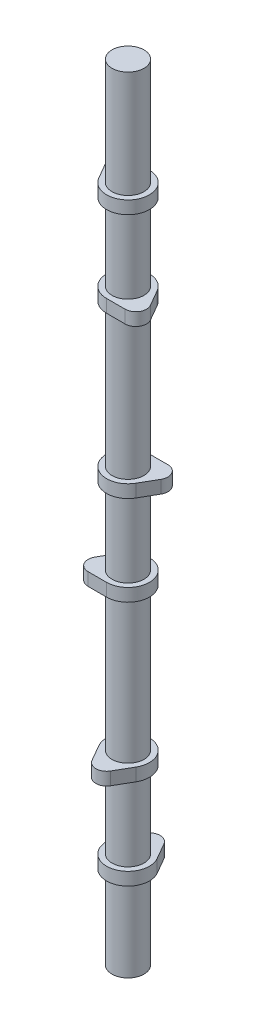
ISO-10303-21;
HEADER;
FILE_DESCRIPTION(('STEP AP214'),'2;1');
FILE_NAME('part.step','',(''),(''),'','','');
FILE_SCHEMA(('AUTOMOTIVE_DESIGN { 1 0 10303 214 1 1 1 1 }'));
ENDSEC;
DATA;
#1=APPLICATION_CONTEXT('core data for automotive mechanical design processes');
#2=APPLICATION_PROTOCOL_DEFINITION('international standard','automotive_design',2000,#1);
#3=PRODUCT_CONTEXT('',#1,'mechanical');
#4=PRODUCT('Part','Part','',(#3));
#5=PRODUCT_RELATED_PRODUCT_CATEGORY('part','',(#4));
#6=PRODUCT_DEFINITION_FORMATION('','',#4);
#7=PRODUCT_DEFINITION_CONTEXT('part definition',#1,'design');
#8=PRODUCT_DEFINITION('design','',#6,#7);
#9=PRODUCT_DEFINITION_SHAPE('','',#8);
#10=(LENGTH_UNIT() NAMED_UNIT(*) SI_UNIT(.MILLI.,.METRE.));
#11=(NAMED_UNIT(*) PLANE_ANGLE_UNIT() SI_UNIT($,.RADIAN.));
#12=(NAMED_UNIT(*) SI_UNIT($,.STERADIAN.) SOLID_ANGLE_UNIT());
#13=UNCERTAINTY_MEASURE_WITH_UNIT(LENGTH_MEASURE(1.E-05),#10,'distance_accuracy_value','');
#14=(GEOMETRIC_REPRESENTATION_CONTEXT(3) GLOBAL_UNCERTAINTY_ASSIGNED_CONTEXT((#13)) GLOBAL_UNIT_ASSIGNED_CONTEXT((#10,
#11,#12)) REPRESENTATION_CONTEXT('',''));
#15=CARTESIAN_POINT('',(0.,0.,0.));
#16=DIRECTION('',(0.,0.,1.));
#17=DIRECTION('',(1.,0.,0.));
#18=AXIS2_PLACEMENT_3D('',#15,#16,#17);
#19=CARTESIAN_POINT('',(0.,416.56,0.));
#20=DIRECTION('',(0.,-1.,0.));
#21=DIRECTION('',(0.,0.,-1.));
#22=AXIS2_PLACEMENT_3D('',#19,#20,#21);
#23=CYLINDRICAL_SURFACE('',#22,9.5);
#24=CARTESIAN_POINT('',(0.,299.72,0.));
#25=DIRECTION('',(0.,1.,0.));
#26=DIRECTION('',(0.,0.,1.));
#27=AXIS2_PLACEMENT_3D('',#24,#25,#26);
#28=CIRCLE('',#27,9.5);
#29=CARTESIAN_POINT('',(0.,299.72,9.5));
#30=VERTEX_POINT('',#29);
#31=EDGE_CURVE('E277',#30,#30,#28,.T.);
#32=ORIENTED_EDGE('',*,*,#31,.T.);
#33=EDGE_LOOP('',(#32));
#34=FACE_BOUND('',#33,.T.);
#35=CARTESIAN_POINT('',(0.,345.44,0.));
#36=DIRECTION('',(0.,1.,0.));
#37=DIRECTION('',(0.,0.,1.));
#38=AXIS2_PLACEMENT_3D('',#35,#36,#37);
#39=CIRCLE('',#38,9.5);
#40=CARTESIAN_POINT('',(0.,345.44,9.5));
#41=VERTEX_POINT('',#40);
#42=EDGE_CURVE('E11',#41,#41,#39,.T.);
#43=ORIENTED_EDGE('',*,*,#42,.F.);
#44=EDGE_LOOP('',(#43));
#45=FACE_BOUND('',#44,.T.);
#46=ADVANCED_FACE('F43',(#34,#45),#23,.T.);
#47=CARTESIAN_POINT('',(0.,207.01,0.));
#48=DIRECTION('',(0.,1.,0.));
#49=DIRECTION('',(0.,0.,1.));
#50=AXIS2_PLACEMENT_3D('',#47,#48,#49);
#51=CIRCLE('',#50,9.5);
#52=CARTESIAN_POINT('',(0.,207.01,9.5));
#53=VERTEX_POINT('',#52);
#54=EDGE_CURVE('E308',#53,#53,#51,.T.);
#55=ORIENTED_EDGE('',*,*,#54,.T.);
#56=EDGE_LOOP('',(#55));
#57=FACE_BOUND('',#56,.T.);
#58=CARTESIAN_POINT('',(0.,292.1,0.));
#59=DIRECTION('',(0.,1.,0.));
#60=DIRECTION('',(0.,0.,1.));
#61=AXIS2_PLACEMENT_3D('',#58,#59,#60);
#62=CIRCLE('',#61,9.5);
#63=CARTESIAN_POINT('',(0.,292.1,9.5));
#64=VERTEX_POINT('',#63);
#65=EDGE_CURVE('E53',#64,#64,#62,.T.);
#66=ORIENTED_EDGE('',*,*,#65,.F.);
#67=EDGE_LOOP('',(#66));
#68=FACE_BOUND('',#67,.T.);
#69=ADVANCED_FACE('F459',(#57,#68),#23,.T.);
#70=CARTESIAN_POINT('',(0.,153.67,0.));
#71=DIRECTION('',(0.,1.,0.));
#72=DIRECTION('',(0.,0.,1.));
#73=AXIS2_PLACEMENT_3D('',#70,#71,#72);
#74=CIRCLE('',#73,9.5);
#75=CARTESIAN_POINT('',(0.,153.67,9.5));
#76=VERTEX_POINT('',#75);
#77=EDGE_CURVE('E339',#76,#76,#74,.T.);
#78=ORIENTED_EDGE('',*,*,#77,.T.);
#79=EDGE_LOOP('',(#78));
#80=FACE_BOUND('',#79,.T.);
#81=CARTESIAN_POINT('',(0.,199.39,0.));
#82=DIRECTION('',(0.,1.,0.));
#83=DIRECTION('',(0.,0.,1.));
#84=AXIS2_PLACEMENT_3D('',#81,#82,#83);
#85=CIRCLE('',#84,9.5);
#86=CARTESIAN_POINT('',(0.,199.39,9.5));
#87=VERTEX_POINT('',#86);
#88=EDGE_CURVE('E412',#87,#87,#85,.T.);
#89=ORIENTED_EDGE('',*,*,#88,.F.);
#90=EDGE_LOOP('',(#89));
#91=FACE_BOUND('',#90,.T.);
#92=ADVANCED_FACE('F466',(#80,#91),#23,.T.);
#93=CARTESIAN_POINT('',(0.,60.96,0.));
#94=DIRECTION('',(0.,1.,0.));
#95=DIRECTION('',(0.,0.,1.));
#96=AXIS2_PLACEMENT_3D('',#93,#94,#95);
#97=CIRCLE('',#96,9.5);
#98=CARTESIAN_POINT('',(0.,60.96,9.5));
#99=VERTEX_POINT('',#98);
#100=EDGE_CURVE('E370',#99,#99,#97,.T.);
#101=ORIENTED_EDGE('',*,*,#100,.T.);
#102=EDGE_LOOP('',(#101));
#103=FACE_BOUND('',#102,.T.);
#104=CARTESIAN_POINT('',(0.,146.05,0.));
#105=DIRECTION('',(0.,1.,0.));
#106=DIRECTION('',(0.,0.,1.));
#107=AXIS2_PLACEMENT_3D('',#104,#105,#106);
#108=CIRCLE('',#107,9.5);
#109=CARTESIAN_POINT('',(0.,146.05,9.5));
#110=VERTEX_POINT('',#109);
#111=EDGE_CURVE('E407',#110,#110,#108,.T.);
#112=ORIENTED_EDGE('',*,*,#111,.F.);
#113=EDGE_LOOP('',(#112));
#114=FACE_BOUND('',#113,.T.);
#115=ADVANCED_FACE('F497',(#103,#114),#23,.T.);
#116=CARTESIAN_POINT('',(0.,7.62000000000002,0.));
#117=DIRECTION('',(0.,1.,0.));
#118=DIRECTION('',(0.,0.,1.));
#119=AXIS2_PLACEMENT_3D('',#116,#117,#118);
#120=CIRCLE('',#119,9.5);
#121=CARTESIAN_POINT('',(0.,7.62000000000002,9.5));
#122=VERTEX_POINT('',#121);
#123=EDGE_CURVE('E374',#122,#122,#120,.F.);
#124=ORIENTED_EDGE('',*,*,#123,.F.);
#125=EDGE_LOOP('',(#124));
#126=FACE_BOUND('',#125,.T.);
#127=CARTESIAN_POINT('',(0.,53.34,0.));
#128=DIRECTION('',(0.,1.,0.));
#129=DIRECTION('',(0.,0.,1.));
#130=AXIS2_PLACEMENT_3D('',#127,#128,#129);
#131=CIRCLE('',#130,9.5);
#132=CARTESIAN_POINT('',(0.,53.34,9.5));
#133=VERTEX_POINT('',#132);
#134=EDGE_CURVE('E404',#133,#133,#131,.T.);
#135=ORIENTED_EDGE('',*,*,#134,.F.);
#136=EDGE_LOOP('',(#135));
#137=FACE_BOUND('',#136,.T.);
#138=ADVANCED_FACE('F485',(#126,#137),#23,.T.);
#139=CARTESIAN_POINT('',(0.,7.62,-12.7));
#140=DIRECTION('',(0.,-1.,0.));
#141=DIRECTION('',(0.,0.,-1.));
#142=AXIS2_PLACEMENT_3D('',#139,#140,#141);
#143=CYLINDRICAL_SURFACE('',#142,6.35);
#144=CARTESIAN_POINT('',(0.,0.,-12.7));
#145=DIRECTION('',(0.,1.,0.));
#146=DIRECTION('',(0.,0.,1.));
#147=AXIS2_PLACEMENT_3D('',#144,#145,#146);
#148=CIRCLE('',#147,6.35);
#149=CARTESIAN_POINT('',(5.49926131403118,0.,-15.875));
#150=VERTEX_POINT('',#149);
#151=CARTESIAN_POINT('',(-5.49926131403118,0.,-15.875));
#152=VERTEX_POINT('',#151);
#153=EDGE_CURVE('E380',#150,#152,#148,.T.);
#154=ORIENTED_EDGE('',*,*,#153,.T.);
#155=DIRECTION('',(0.,-1.,0.));
#156=VECTOR('',#155,1.);
#157=CARTESIAN_POINT('',(-5.49926131403118,7.62,-15.875));
#158=LINE('',#157,#156);
#159=CARTESIAN_POINT('',(-5.49926131403118,7.62,-15.875));
#160=VERTEX_POINT('',#159);
#161=EDGE_CURVE('E399',#160,#152,#158,.T.);
#162=ORIENTED_EDGE('',*,*,#161,.F.);
#163=CARTESIAN_POINT('',(0.,7.62,-12.7));
#164=DIRECTION('',(0.,1.,0.));
#165=DIRECTION('',(0.,0.,1.));
#166=AXIS2_PLACEMENT_3D('',#163,#164,#165);
#167=CIRCLE('',#166,6.35);
#168=CARTESIAN_POINT('',(5.49926131403118,7.62,-15.875));
#169=VERTEX_POINT('',#168);
#170=EDGE_CURVE('E381',#169,#160,#167,.T.);
#171=ORIENTED_EDGE('',*,*,#170,.F.);
#172=DIRECTION('',(0.,-1.,0.));
#173=VECTOR('',#172,1.);
#174=CARTESIAN_POINT('',(5.49926131403118,7.62,-15.875));
#175=LINE('',#174,#173);
#176=EDGE_CURVE('E387',#169,#150,#175,.T.);
#177=ORIENTED_EDGE('',*,*,#176,.T.);
#178=EDGE_LOOP('',(#154,#162,#171,#177));
#179=FACE_BOUND('',#178,.T.);
#180=ADVANCED_FACE('F45',(#179),#143,.T.);
#181=CARTESIAN_POINT('',(-5.49926131403118,7.62,-15.875));
#182=DIRECTION('',(0.866025403784439,0.,0.5));
#183=DIRECTION('',(0.5,0.,-0.866025403784439));
#184=AXIS2_PLACEMENT_3D('',#181,#182,#183);
#185=PLANE('',#184);
#186=DIRECTION('',(-0.5,0.,0.866025403784439));
#187=VECTOR('',#186,1.);
#188=CARTESIAN_POINT('',(-5.49926131403118,0.,-15.875));
#189=LINE('',#188,#187);
#190=CARTESIAN_POINT('',(-10.9985226280624,0.,-6.35000000000001));
#191=VERTEX_POINT('',#190);
#192=EDGE_CURVE('E390',#152,#191,#189,.T.);
#193=ORIENTED_EDGE('',*,*,#192,.T.);
#194=DIRECTION('',(0.,-1.,0.));
#195=VECTOR('',#194,1.);
#196=CARTESIAN_POINT('',(-10.9985226280624,7.62,-6.35000000000001));
#197=LINE('',#196,#195);
#198=CARTESIAN_POINT('',(-10.9985226280624,7.62,-6.35000000000001));
#199=VERTEX_POINT('',#198);
#200=EDGE_CURVE('E397',#199,#191,#197,.T.);
#201=ORIENTED_EDGE('',*,*,#200,.F.);
#202=DIRECTION('',(-0.5,0.,0.866025403784439));
#203=VECTOR('',#202,1.);
#204=CARTESIAN_POINT('',(-5.49926131403118,7.62,-15.875));
#205=LINE('',#204,#203);
#206=EDGE_CURVE('E93',#160,#199,#205,.T.);
#207=ORIENTED_EDGE('',*,*,#206,.F.);
#208=ORIENTED_EDGE('',*,*,#161,.T.);
#209=EDGE_LOOP('',(#193,#201,#207,#208));
#210=FACE_BOUND('',#209,.T.);
#211=ADVANCED_FACE('F504',(#210),#185,.F.);
#212=CARTESIAN_POINT('',(0.,7.62,0.));
#213=DIRECTION('',(0.,-1.,0.));
#214=DIRECTION('',(0.,0.,-1.));
#215=AXIS2_PLACEMENT_3D('',#212,#213,#214);
#216=CYLINDRICAL_SURFACE('',#215,12.7);
#217=CARTESIAN_POINT('',(0.,0.,0.));
#218=DIRECTION('',(0.,1.,0.));
#219=DIRECTION('',(0.,0.,1.));
#220=AXIS2_PLACEMENT_3D('',#217,#218,#219);
#221=CIRCLE('',#220,12.7);
#222=CARTESIAN_POINT('',(10.9985226280624,0.,-6.35));
#223=VERTEX_POINT('',#222);
#224=EDGE_CURVE('E79',#191,#223,#221,.T.);
#225=ORIENTED_EDGE('',*,*,#224,.T.);
#226=DIRECTION('',(0.,-1.,0.));
#227=VECTOR('',#226,1.);
#228=CARTESIAN_POINT('',(10.9985226280624,7.62,-6.35));
#229=LINE('',#228,#227);
#230=CARTESIAN_POINT('',(10.9985226280624,7.62,-6.35));
#231=VERTEX_POINT('',#230);
#232=EDGE_CURVE('E395',#231,#223,#229,.T.);
#233=ORIENTED_EDGE('',*,*,#232,.F.);
#234=CARTESIAN_POINT('',(0.,7.62,0.));
#235=DIRECTION('',(0.,1.,0.));
#236=DIRECTION('',(0.,0.,1.));
#237=AXIS2_PLACEMENT_3D('',#234,#235,#236);
#238=CIRCLE('',#237,12.7);
#239=EDGE_CURVE('E384',#199,#231,#238,.T.);
#240=ORIENTED_EDGE('',*,*,#239,.F.);
#241=ORIENTED_EDGE('',*,*,#200,.T.);
#242=EDGE_LOOP('',(#225,#233,#240,#241));
#243=FACE_BOUND('',#242,.T.);
#244=ADVANCED_FACE('F855',(#243),#216,.T.);
#245=CARTESIAN_POINT('',(5.49926131403118,7.62,-15.875));
#246=DIRECTION('',(-0.866025403784438,0.,0.5));
#247=DIRECTION('',(0.5,0.,0.866025403784439));
#248=AXIS2_PLACEMENT_3D('',#245,#246,#247);
#249=PLANE('',#248);
#250=DIRECTION('',(-0.5,0.,-0.866025403784439));
#251=VECTOR('',#250,1.);
#252=CARTESIAN_POINT('',(5.49926131403118,0.,-15.875));
#253=LINE('',#252,#251);
#254=EDGE_CURVE('E85',#223,#150,#253,.T.);
#255=ORIENTED_EDGE('',*,*,#254,.T.);
#256=ORIENTED_EDGE('',*,*,#176,.F.);
#257=DIRECTION('',(-0.5,0.,-0.866025403784439));
#258=VECTOR('',#257,1.);
#259=CARTESIAN_POINT('',(5.49926131403118,7.62,-15.875));
#260=LINE('',#259,#258);
#261=EDGE_CURVE('E61',#231,#169,#260,.T.);
#262=ORIENTED_EDGE('',*,*,#261,.F.);
#263=ORIENTED_EDGE('',*,*,#232,.T.);
#264=EDGE_LOOP('',(#255,#256,#262,#263));
#265=FACE_BOUND('',#264,.T.);
#266=ADVANCED_FACE('F844',(#265),#249,.F.);
#267=CARTESIAN_POINT('',(0.,7.62,-12.7));
#268=DIRECTION('',(0.,1.,0.));
#269=DIRECTION('',(0.,0.,1.));
#270=AXIS2_PLACEMENT_3D('',#267,#268,#269);
#271=PLANE('',#270);
#272=ORIENTED_EDGE('',*,*,#123,.T.);
#273=EDGE_LOOP('',(#272));
#274=FACE_BOUND('',#273,.T.);
#275=ORIENTED_EDGE('',*,*,#170,.T.);
#276=ORIENTED_EDGE('',*,*,#206,.T.);
#277=ORIENTED_EDGE('',*,*,#239,.T.);
#278=ORIENTED_EDGE('',*,*,#261,.T.);
#279=EDGE_LOOP('',(#275,#276,#277,#278));
#280=FACE_BOUND('',#279,.T.);
#281=ADVANCED_FACE('F836',(#274,#280),#271,.T.);
#282=CARTESIAN_POINT('',(0.,0.,-12.7));
#283=DIRECTION('',(0.,1.,0.));
#284=DIRECTION('',(0.,0.,1.));
#285=AXIS2_PLACEMENT_3D('',#282,#283,#284);
#286=PLANE('',#285);
#287=CARTESIAN_POINT('',(0.,0.,0.));
#288=DIRECTION('',(0.,1.,0.));
#289=DIRECTION('',(0.,0.,1.));
#290=AXIS2_PLACEMENT_3D('',#287,#288,#289);
#291=CIRCLE('',#290,9.5);
#292=CARTESIAN_POINT('',(0.,0.,9.5));
#293=VERTEX_POINT('',#292);
#294=EDGE_CURVE('E401',#293,#293,#291,.F.);
#295=ORIENTED_EDGE('',*,*,#294,.F.);
#296=EDGE_LOOP('',(#295));
#297=FACE_BOUND('',#296,.T.);
#298=ORIENTED_EDGE('',*,*,#153,.F.);
#299=ORIENTED_EDGE('',*,*,#254,.F.);
#300=ORIENTED_EDGE('',*,*,#224,.F.);
#301=ORIENTED_EDGE('',*,*,#192,.F.);
#302=EDGE_LOOP('',(#298,#299,#300,#301));
#303=FACE_BOUND('',#302,.T.);
#304=ADVANCED_FACE('F493',(#297,#303),#286,.F.);
#305=CARTESIAN_POINT('',(0.,-49.53,0.));
#306=DIRECTION('',(0.,1.,0.));
#307=DIRECTION('',(0.,0.,1.));
#308=AXIS2_PLACEMENT_3D('',#305,#306,#307);
#309=PLANE('',#308);
#310=CARTESIAN_POINT('',(0.,-49.53,0.));
#311=DIRECTION('',(0.,1.,0.));
#312=DIRECTION('',(0.,0.,1.));
#313=AXIS2_PLACEMENT_3D('',#310,#311,#312);
#314=CIRCLE('',#313,9.5);
#315=CARTESIAN_POINT('',(0.,-49.53,9.5));
#316=VERTEX_POINT('',#315);
#317=EDGE_CURVE('E375',#316,#316,#314,.T.);
#318=ORIENTED_EDGE('',*,*,#317,.F.);
#319=EDGE_LOOP('',(#318));
#320=FACE_BOUND('',#319,.T.);
#321=ADVANCED_FACE('F483',(#320),#309,.F.);
#322=ORIENTED_EDGE('',*,*,#317,.T.);
#323=EDGE_LOOP('',(#322));
#324=FACE_BOUND('',#323,.T.);
#325=ORIENTED_EDGE('',*,*,#294,.T.);
#326=EDGE_LOOP('',(#325));
#327=FACE_BOUND('',#326,.T.);
#328=ADVANCED_FACE('F473',(#324,#327),#23,.T.);
#329=CARTESIAN_POINT('',(0.,60.96,12.7));
#330=DIRECTION('',(0.,-1.,0.));
#331=DIRECTION('',(0.,0.,1.));
#332=AXIS2_PLACEMENT_3D('',#329,#330,#331);
#333=CYLINDRICAL_SURFACE('',#332,6.35);
#334=CARTESIAN_POINT('',(0.,53.34,12.7));
#335=DIRECTION('',(0.,1.,0.));
#336=DIRECTION('',(0.,0.,-1.));
#337=AXIS2_PLACEMENT_3D('',#334,#335,#336);
#338=CIRCLE('',#337,6.35);
#339=CARTESIAN_POINT('',(-5.4992613140313,53.34,15.875));
#340=VERTEX_POINT('',#339);
#341=CARTESIAN_POINT('',(5.49926131403107,53.34,15.875));
#342=VERTEX_POINT('',#341);
#343=EDGE_CURVE('E351',#340,#342,#338,.T.);
#344=ORIENTED_EDGE('',*,*,#343,.T.);
#345=DIRECTION('',(0.,-1.,0.));
#346=VECTOR('',#345,1.);
#347=CARTESIAN_POINT('',(5.49926131403107,60.96,15.875));
#348=LINE('',#347,#346);
#349=CARTESIAN_POINT('',(5.49926131403107,60.96,15.875));
#350=VERTEX_POINT('',#349);
#351=EDGE_CURVE('E367',#350,#342,#348,.T.);
#352=ORIENTED_EDGE('',*,*,#351,.F.);
#353=CARTESIAN_POINT('',(0.,60.96,12.7));
#354=DIRECTION('',(0.,1.,0.));
#355=DIRECTION('',(0.,0.,-1.));
#356=AXIS2_PLACEMENT_3D('',#353,#354,#355);
#357=CIRCLE('',#356,6.35);
#358=CARTESIAN_POINT('',(-5.4992613140313,60.96,15.875));
#359=VERTEX_POINT('',#358);
#360=EDGE_CURVE('E340',#359,#350,#357,.T.);
#361=ORIENTED_EDGE('',*,*,#360,.F.);
#362=DIRECTION('',(0.,-1.,0.));
#363=VECTOR('',#362,1.);
#364=CARTESIAN_POINT('',(-5.4992613140313,60.96,15.875));
#365=LINE('',#364,#363);
#366=EDGE_CURVE('E350',#359,#340,#365,.T.);
#367=ORIENTED_EDGE('',*,*,#366,.T.);
#368=EDGE_LOOP('',(#344,#352,#361,#367));
#369=FACE_BOUND('',#368,.T.);
#370=ADVANCED_FACE('F482',(#369),#333,.T.);
#371=CARTESIAN_POINT('',(5.49926131403107,60.96,15.875));
#372=DIRECTION('',(-0.866025403784435,0.,-0.500000000000006));
#373=DIRECTION('',(-0.500000000000006,0.,0.866025403784435));
#374=AXIS2_PLACEMENT_3D('',#371,#372,#373);
#375=PLANE('',#374);
#376=DIRECTION('',(0.500000000000006,0.,-0.866025403784435));
#377=VECTOR('',#376,1.);
#378=CARTESIAN_POINT('',(5.49926131403107,53.34,15.875));
#379=LINE('',#378,#377);
#380=CARTESIAN_POINT('',(10.9985226280623,53.34,6.35000000000008));
#381=VERTEX_POINT('',#380);
#382=EDGE_CURVE('E354',#342,#381,#379,.T.);
#383=ORIENTED_EDGE('',*,*,#382,.T.);
#384=DIRECTION('',(0.,-1.,0.));
#385=VECTOR('',#384,1.);
#386=CARTESIAN_POINT('',(10.9985226280623,60.96,6.35000000000008));
#387=LINE('',#386,#385);
#388=CARTESIAN_POINT('',(10.9985226280623,60.96,6.35000000000008));
#389=VERTEX_POINT('',#388);
#390=EDGE_CURVE('E364',#389,#381,#387,.T.);
#391=ORIENTED_EDGE('',*,*,#390,.F.);
#392=DIRECTION('',(0.500000000000006,0.,-0.866025403784435));
#393=VECTOR('',#392,1.);
#394=CARTESIAN_POINT('',(5.49926131403107,60.96,15.875));
#395=LINE('',#394,#393);
#396=EDGE_CURVE('E343',#350,#389,#395,.T.);
#397=ORIENTED_EDGE('',*,*,#396,.F.);
#398=ORIENTED_EDGE('',*,*,#351,.T.);
#399=EDGE_LOOP('',(#383,#391,#397,#398));
#400=FACE_BOUND('',#399,.T.);
#401=ADVANCED_FACE('F490',(#400),#375,.F.);
#402=CARTESIAN_POINT('',(0.,60.96,0.));
#403=DIRECTION('',(0.,-1.,0.));
#404=DIRECTION('',(0.,0.,1.));
#405=AXIS2_PLACEMENT_3D('',#402,#403,#404);
#406=CYLINDRICAL_SURFACE('',#405,12.7);
#407=CARTESIAN_POINT('',(0.,53.34,0.));
#408=DIRECTION('',(0.,1.,0.));
#409=DIRECTION('',(0.,0.,-1.));
#410=AXIS2_PLACEMENT_3D('',#407,#408,#409);
#411=CIRCLE('',#410,12.7);
#412=CARTESIAN_POINT('',(-10.9985226280624,53.34,6.34999999999992));
#413=VERTEX_POINT('',#412);
#414=EDGE_CURVE('E356',#381,#413,#411,.T.);
#415=ORIENTED_EDGE('',*,*,#414,.T.);
#416=DIRECTION('',(0.,-1.,0.));
#417=VECTOR('',#416,1.);
#418=CARTESIAN_POINT('',(-10.9985226280624,60.96,6.34999999999992));
#419=LINE('',#418,#417);
#420=CARTESIAN_POINT('',(-10.9985226280624,60.96,6.34999999999992));
#421=VERTEX_POINT('',#420);
#422=EDGE_CURVE('E361',#421,#413,#419,.T.);
#423=ORIENTED_EDGE('',*,*,#422,.F.);
#424=CARTESIAN_POINT('',(0.,60.96,0.));
#425=DIRECTION('',(0.,1.,0.));
#426=DIRECTION('',(0.,0.,-1.));
#427=AXIS2_PLACEMENT_3D('',#424,#425,#426);
#428=CIRCLE('',#427,12.7);
#429=EDGE_CURVE('E346',#389,#421,#428,.T.);
#430=ORIENTED_EDGE('',*,*,#429,.F.);
#431=ORIENTED_EDGE('',*,*,#390,.T.);
#432=EDGE_LOOP('',(#415,#423,#430,#431));
#433=FACE_BOUND('',#432,.T.);
#434=ADVANCED_FACE('F529',(#433),#406,.T.);
#435=CARTESIAN_POINT('',(-5.4992613140313,60.96,15.875));
#436=DIRECTION('',(0.866025403784442,0.,-0.499999999999994));
#437=DIRECTION('',(-0.499999999999994,0.,-0.866025403784442));
#438=AXIS2_PLACEMENT_3D('',#435,#436,#437);
#439=PLANE('',#438);
#440=DIRECTION('',(0.499999999999994,0.,0.866025403784442));
#441=VECTOR('',#440,1.);
#442=CARTESIAN_POINT('',(-5.4992613140313,53.34,15.875));
#443=LINE('',#442,#441);
#444=EDGE_CURVE('E344',#413,#340,#443,.T.);
#445=ORIENTED_EDGE('',*,*,#444,.T.);
#446=ORIENTED_EDGE('',*,*,#366,.F.);
#447=DIRECTION('',(0.499999999999994,0.,0.866025403784442));
#448=VECTOR('',#447,1.);
#449=CARTESIAN_POINT('',(-5.4992613140313,60.96,15.875));
#450=LINE('',#449,#448);
#451=EDGE_CURVE('E348',#421,#359,#450,.T.);
#452=ORIENTED_EDGE('',*,*,#451,.F.);
#453=ORIENTED_EDGE('',*,*,#422,.T.);
#454=EDGE_LOOP('',(#445,#446,#452,#453));
#455=FACE_BOUND('',#454,.T.);
#456=ADVANCED_FACE('F525',(#455),#439,.F.);
#457=CARTESIAN_POINT('',(0.,60.96,12.7));
#458=DIRECTION('',(0.,1.,0.));
#459=DIRECTION('',(0.,0.,-1.));
#460=AXIS2_PLACEMENT_3D('',#457,#458,#459);
#461=PLANE('',#460);
#462=ORIENTED_EDGE('',*,*,#100,.F.);
#463=EDGE_LOOP('',(#462));
#464=FACE_BOUND('',#463,.T.);
#465=ORIENTED_EDGE('',*,*,#360,.T.);
#466=ORIENTED_EDGE('',*,*,#396,.T.);
#467=ORIENTED_EDGE('',*,*,#429,.T.);
#468=ORIENTED_EDGE('',*,*,#451,.T.);
#469=EDGE_LOOP('',(#465,#466,#467,#468));
#470=FACE_BOUND('',#469,.T.);
#471=ADVANCED_FACE('F515',(#464,#470),#461,.T.);
#472=CARTESIAN_POINT('',(0.,53.34,12.7));
#473=DIRECTION('',(0.,1.,0.));
#474=DIRECTION('',(0.,0.,-1.));
#475=AXIS2_PLACEMENT_3D('',#472,#473,#474);
#476=PLANE('',#475);
#477=ORIENTED_EDGE('',*,*,#134,.T.);
#478=EDGE_LOOP('',(#477));
#479=FACE_BOUND('',#478,.T.);
#480=ORIENTED_EDGE('',*,*,#343,.F.);
#481=ORIENTED_EDGE('',*,*,#444,.F.);
#482=ORIENTED_EDGE('',*,*,#414,.F.);
#483=ORIENTED_EDGE('',*,*,#382,.F.);
#484=EDGE_LOOP('',(#480,#481,#482,#483));
#485=FACE_BOUND('',#484,.T.);
#486=ADVANCED_FACE('F511',(#479,#485),#476,.F.);
#487=CARTESIAN_POINT('',(-10.9985226280623,153.67,6.35000000000005));
#488=DIRECTION('',(0.,-1.,0.));
#489=DIRECTION('',(-0.866025403784436,0.,0.500000000000004));
#490=AXIS2_PLACEMENT_3D('',#487,#488,#489);
#491=CYLINDRICAL_SURFACE('',#490,6.35);
#492=CARTESIAN_POINT('',(-10.9985226280623,146.05,6.35000000000005));
#493=DIRECTION('',(0.,1.,0.));
#494=DIRECTION('',(0.866025403784436,0.,-0.500000000000004));
#495=AXIS2_PLACEMENT_3D('',#492,#493,#494);
#496=CIRCLE('',#495,6.35);
#497=CARTESIAN_POINT('',(-16.4977839420935,146.05,3.17500000000008));
#498=VERTEX_POINT('',#497);
#499=CARTESIAN_POINT('',(-10.9985226280623,146.05,12.7000000000001));
#500=VERTEX_POINT('',#499);
#501=EDGE_CURVE('E320',#498,#500,#496,.T.);
#502=ORIENTED_EDGE('',*,*,#501,.T.);
#503=DIRECTION('',(0.,-1.,0.));
#504=VECTOR('',#503,1.);
#505=CARTESIAN_POINT('',(-10.9985226280623,153.67,12.7000000000001));
#506=LINE('',#505,#504);
#507=CARTESIAN_POINT('',(-10.9985226280623,153.67,12.7000000000001));
#508=VERTEX_POINT('',#507);
#509=EDGE_CURVE('E336',#508,#500,#506,.T.);
#510=ORIENTED_EDGE('',*,*,#509,.F.);
#511=CARTESIAN_POINT('',(-10.9985226280623,153.67,6.35000000000005));
#512=DIRECTION('',(0.,1.,0.));
#513=DIRECTION('',(0.866025403784436,0.,-0.500000000000004));
#514=AXIS2_PLACEMENT_3D('',#511,#512,#513);
#515=CIRCLE('',#514,6.35);
#516=CARTESIAN_POINT('',(-16.4977839420935,153.67,3.17500000000008));
#517=VERTEX_POINT('',#516);
#518=EDGE_CURVE('E309',#517,#508,#515,.T.);
#519=ORIENTED_EDGE('',*,*,#518,.F.);
#520=DIRECTION('',(0.,-1.,0.));
#521=VECTOR('',#520,1.);
#522=CARTESIAN_POINT('',(-16.4977839420935,153.67,3.17500000000008));
#523=LINE('',#522,#521);
#524=EDGE_CURVE('E319',#517,#498,#523,.T.);
#525=ORIENTED_EDGE('',*,*,#524,.T.);
#526=EDGE_LOOP('',(#502,#510,#519,#525));
#527=FACE_BOUND('',#526,.T.);
#528=ADVANCED_FACE('F514',(#527),#491,.T.);
#529=CARTESIAN_POINT('',(-10.9985226280623,153.67,12.7000000000001));
#530=DIRECTION('',(0.,0.,-1.));
#531=DIRECTION('',(-1.,0.,0.));
#532=AXIS2_PLACEMENT_3D('',#529,#530,#531);
#533=PLANE('',#532);
#534=DIRECTION('',(1.,0.,0.));
#535=VECTOR('',#534,1.);
#536=CARTESIAN_POINT('',(-10.9985226280623,146.05,12.7000000000001));
#537=LINE('',#536,#535);
#538=CARTESIAN_POINT('',(0.,146.05,12.7));
#539=VERTEX_POINT('',#538);
#540=EDGE_CURVE('E323',#500,#539,#537,.T.);
#541=ORIENTED_EDGE('',*,*,#540,.T.);
#542=DIRECTION('',(0.,-1.,0.));
#543=VECTOR('',#542,1.);
#544=CARTESIAN_POINT('',(0.,153.67,12.7));
#545=LINE('',#544,#543);
#546=CARTESIAN_POINT('',(0.,153.67,12.7));
#547=VERTEX_POINT('',#546);
#548=EDGE_CURVE('E333',#547,#539,#545,.T.);
#549=ORIENTED_EDGE('',*,*,#548,.F.);
#550=DIRECTION('',(1.,0.,0.));
#551=VECTOR('',#550,1.);
#552=CARTESIAN_POINT('',(-10.9985226280623,153.67,12.7000000000001));
#553=LINE('',#552,#551);
#554=EDGE_CURVE('E312',#508,#547,#553,.T.);
#555=ORIENTED_EDGE('',*,*,#554,.F.);
#556=ORIENTED_EDGE('',*,*,#509,.T.);
#557=EDGE_LOOP('',(#541,#549,#555,#556));
#558=FACE_BOUND('',#557,.T.);
#559=ADVANCED_FACE('F581',(#558),#533,.F.);
#560=CARTESIAN_POINT('',(0.,153.67,0.));
#561=DIRECTION('',(0.,-1.,0.));
#562=DIRECTION('',(-0.866025403784436,0.,0.500000000000004));
#563=AXIS2_PLACEMENT_3D('',#560,#561,#562);
#564=CYLINDRICAL_SURFACE('',#563,12.7);
#565=CARTESIAN_POINT('',(0.,146.05,0.));
#566=DIRECTION('',(0.,1.,0.));
#567=DIRECTION('',(0.866025403784436,0.,-0.500000000000004));
#568=AXIS2_PLACEMENT_3D('',#565,#566,#567);
#569=CIRCLE('',#568,12.7);
#570=CARTESIAN_POINT('',(-10.9985226280624,146.05,-6.34999999999995));
#571=VERTEX_POINT('',#570);
#572=EDGE_CURVE('E325',#539,#571,#569,.T.);
#573=ORIENTED_EDGE('',*,*,#572,.T.);
#574=DIRECTION('',(0.,-1.,0.));
#575=VECTOR('',#574,1.);
#576=CARTESIAN_POINT('',(-10.9985226280624,153.67,-6.34999999999995));
#577=LINE('',#576,#575);
#578=CARTESIAN_POINT('',(-10.9985226280624,153.67,-6.34999999999995));
#579=VERTEX_POINT('',#578);
#580=EDGE_CURVE('E330',#579,#571,#577,.T.);
#581=ORIENTED_EDGE('',*,*,#580,.F.);
#582=CARTESIAN_POINT('',(0.,153.67,0.));
#583=DIRECTION('',(0.,1.,0.));
#584=DIRECTION('',(0.866025403784436,0.,-0.500000000000004));
#585=AXIS2_PLACEMENT_3D('',#582,#583,#584);
#586=CIRCLE('',#585,12.7);
#587=EDGE_CURVE('E315',#547,#579,#586,.T.);
#588=ORIENTED_EDGE('',*,*,#587,.F.);
#589=ORIENTED_EDGE('',*,*,#548,.T.);
#590=EDGE_LOOP('',(#573,#581,#588,#589));
#591=FACE_BOUND('',#590,.T.);
#592=ADVANCED_FACE('F590',(#591),#564,.T.);
#593=CARTESIAN_POINT('',(-16.4977839420935,153.67,3.17500000000008));
#594=DIRECTION('',(0.866025403784441,0.,0.499999999999996));
#595=DIRECTION('',(0.499999999999996,0.,-0.866025403784441));
#596=AXIS2_PLACEMENT_3D('',#593,#594,#595);
#597=PLANE('',#596);
#598=DIRECTION('',(-0.499999999999996,0.,0.866025403784441));
#599=VECTOR('',#598,1.);
#600=CARTESIAN_POINT('',(-16.4977839420935,146.05,3.17500000000008));
#601=LINE('',#600,#599);
#602=EDGE_CURVE('E313',#571,#498,#601,.T.);
#603=ORIENTED_EDGE('',*,*,#602,.T.);
#604=ORIENTED_EDGE('',*,*,#524,.F.);
#605=DIRECTION('',(-0.499999999999996,0.,0.866025403784441));
#606=VECTOR('',#605,1.);
#607=CARTESIAN_POINT('',(-16.4977839420935,153.67,3.17500000000008));
#608=LINE('',#607,#606);
#609=EDGE_CURVE('E317',#579,#517,#608,.T.);
#610=ORIENTED_EDGE('',*,*,#609,.F.);
#611=ORIENTED_EDGE('',*,*,#580,.T.);
#612=EDGE_LOOP('',(#603,#604,#610,#611));
#613=FACE_BOUND('',#612,.T.);
#614=ADVANCED_FACE('F599',(#613),#597,.F.);
#615=CARTESIAN_POINT('',(-10.9985226280623,153.67,6.35000000000005));
#616=DIRECTION('',(0.,1.,0.));
#617=DIRECTION('',(0.866025403784436,0.,-0.500000000000004));
#618=AXIS2_PLACEMENT_3D('',#615,#616,#617);
#619=PLANE('',#618);
#620=ORIENTED_EDGE('',*,*,#77,.F.);
#621=EDGE_LOOP('',(#620));
#622=FACE_BOUND('',#621,.T.);
#623=ORIENTED_EDGE('',*,*,#518,.T.);
#624=ORIENTED_EDGE('',*,*,#554,.T.);
#625=ORIENTED_EDGE('',*,*,#587,.T.);
#626=ORIENTED_EDGE('',*,*,#609,.T.);
#627=EDGE_LOOP('',(#623,#624,#625,#626));
#628=FACE_BOUND('',#627,.T.);
#629=ADVANCED_FACE('F609',(#622,#628),#619,.T.);
#630=CARTESIAN_POINT('',(-10.9985226280623,146.05,6.35000000000005));
#631=DIRECTION('',(0.,1.,0.));
#632=DIRECTION('',(0.866025403784436,0.,-0.500000000000004));
#633=AXIS2_PLACEMENT_3D('',#630,#631,#632);
#634=PLANE('',#633);
#635=ORIENTED_EDGE('',*,*,#111,.T.);
#636=EDGE_LOOP('',(#635));
#637=FACE_BOUND('',#636,.T.);
#638=ORIENTED_EDGE('',*,*,#501,.F.);
#639=ORIENTED_EDGE('',*,*,#602,.F.);
#640=ORIENTED_EDGE('',*,*,#572,.F.);
#641=ORIENTED_EDGE('',*,*,#540,.F.);
#642=EDGE_LOOP('',(#638,#639,#640,#641));
#643=FACE_BOUND('',#642,.T.);
#644=ADVANCED_FACE('F619',(#637,#643),#634,.F.);
#645=CARTESIAN_POINT('',(10.9985226280624,207.01,-6.34999999999997));
#646=DIRECTION('',(0.,-1.,0.));
#647=DIRECTION('',(0.86602540378444,0.,-0.499999999999998));
#648=AXIS2_PLACEMENT_3D('',#645,#646,#647);
#649=CYLINDRICAL_SURFACE('',#648,6.35);
#650=CARTESIAN_POINT('',(10.9985226280624,199.39,-6.34999999999997));
#651=DIRECTION('',(0.,1.,0.));
#652=DIRECTION('',(-0.86602540378444,0.,0.499999999999998));
#653=AXIS2_PLACEMENT_3D('',#650,#651,#652);
#654=CIRCLE('',#653,6.35);
#655=CARTESIAN_POINT('',(16.4977839420936,199.39,-3.17499999999996));
#656=VERTEX_POINT('',#655);
#657=CARTESIAN_POINT('',(10.9985226280624,199.39,-12.7));
#658=VERTEX_POINT('',#657);
#659=EDGE_CURVE('E289',#656,#658,#654,.T.);
#660=ORIENTED_EDGE('',*,*,#659,.T.);
#661=DIRECTION('',(0.,-1.,0.));
#662=VECTOR('',#661,1.);
#663=CARTESIAN_POINT('',(10.9985226280624,207.01,-12.7));
#664=LINE('',#663,#662);
#665=CARTESIAN_POINT('',(10.9985226280624,207.01,-12.7));
#666=VERTEX_POINT('',#665);
#667=EDGE_CURVE('E305',#666,#658,#664,.T.);
#668=ORIENTED_EDGE('',*,*,#667,.F.);
#669=CARTESIAN_POINT('',(10.9985226280624,207.01,-6.34999999999997));
#670=DIRECTION('',(0.,1.,0.));
#671=DIRECTION('',(-0.86602540378444,0.,0.499999999999998));
#672=AXIS2_PLACEMENT_3D('',#669,#670,#671);
#673=CIRCLE('',#672,6.35);
#674=CARTESIAN_POINT('',(16.4977839420936,207.01,-3.17499999999996));
#675=VERTEX_POINT('',#674);
#676=EDGE_CURVE('E278',#675,#666,#673,.T.);
#677=ORIENTED_EDGE('',*,*,#676,.F.);
#678=DIRECTION('',(0.,-1.,0.));
#679=VECTOR('',#678,1.);
#680=CARTESIAN_POINT('',(16.4977839420936,207.01,-3.17499999999996));
#681=LINE('',#680,#679);
#682=EDGE_CURVE('E288',#675,#656,#681,.T.);
#683=ORIENTED_EDGE('',*,*,#682,.T.);
#684=EDGE_LOOP('',(#660,#668,#677,#683));
#685=FACE_BOUND('',#684,.T.);
#686=ADVANCED_FACE('F629',(#685),#649,.T.);
#687=CARTESIAN_POINT('',(10.9985226280624,207.01,-12.7));
#688=DIRECTION('',(0.,0.,1.));
#689=DIRECTION('',(1.,0.,0.));
#690=AXIS2_PLACEMENT_3D('',#687,#688,#689);
#691=PLANE('',#690);
#692=DIRECTION('',(-1.,0.,0.));
#693=VECTOR('',#692,1.);
#694=CARTESIAN_POINT('',(10.9985226280624,199.39,-12.7));
#695=LINE('',#694,#693);
#696=CARTESIAN_POINT('',(0.,199.39,-12.7));
#697=VERTEX_POINT('',#696);
#698=EDGE_CURVE('E292',#658,#697,#695,.T.);
#699=ORIENTED_EDGE('',*,*,#698,.T.);
#700=DIRECTION('',(0.,-1.,0.));
#701=VECTOR('',#700,1.);
#702=CARTESIAN_POINT('',(0.,207.01,-12.7));
#703=LINE('',#702,#701);
#704=CARTESIAN_POINT('',(0.,207.01,-12.7));
#705=VERTEX_POINT('',#704);
#706=EDGE_CURVE('E302',#705,#697,#703,.T.);
#707=ORIENTED_EDGE('',*,*,#706,.F.);
#708=DIRECTION('',(-1.,0.,0.));
#709=VECTOR('',#708,1.);
#710=CARTESIAN_POINT('',(10.9985226280624,207.01,-12.7));
#711=LINE('',#710,#709);
#712=EDGE_CURVE('E281',#666,#705,#711,.T.);
#713=ORIENTED_EDGE('',*,*,#712,.F.);
#714=ORIENTED_EDGE('',*,*,#667,.T.);
#715=EDGE_LOOP('',(#699,#707,#713,#714));
#716=FACE_BOUND('',#715,.T.);
#717=ADVANCED_FACE('F639',(#716),#691,.F.);
#718=CARTESIAN_POINT('',(0.,207.01,0.));
#719=DIRECTION('',(0.,-1.,0.));
#720=DIRECTION('',(0.86602540378444,0.,-0.499999999999998));
#721=AXIS2_PLACEMENT_3D('',#718,#719,#720);
#722=CYLINDRICAL_SURFACE('',#721,12.7);
#723=CARTESIAN_POINT('',(0.,199.39,0.));
#724=DIRECTION('',(0.,1.,0.));
#725=DIRECTION('',(-0.86602540378444,0.,0.499999999999998));
#726=AXIS2_PLACEMENT_3D('',#723,#724,#725);
#727=CIRCLE('',#726,12.7);
#728=CARTESIAN_POINT('',(10.9985226280624,199.39,6.35000000000003));
#729=VERTEX_POINT('',#728);
#730=EDGE_CURVE('E294',#697,#729,#727,.T.);
#731=ORIENTED_EDGE('',*,*,#730,.T.);
#732=DIRECTION('',(0.,-1.,0.));
#733=VECTOR('',#732,1.);
#734=CARTESIAN_POINT('',(10.9985226280624,207.01,6.35000000000003));
#735=LINE('',#734,#733);
#736=CARTESIAN_POINT('',(10.9985226280624,207.01,6.35000000000003));
#737=VERTEX_POINT('',#736);
#738=EDGE_CURVE('E299',#737,#729,#735,.T.);
#739=ORIENTED_EDGE('',*,*,#738,.F.);
#740=CARTESIAN_POINT('',(0.,207.01,0.));
#741=DIRECTION('',(0.,1.,0.));
#742=DIRECTION('',(-0.86602540378444,0.,0.499999999999998));
#743=AXIS2_PLACEMENT_3D('',#740,#741,#742);
#744=CIRCLE('',#743,12.7);
#745=EDGE_CURVE('E284',#705,#737,#744,.T.);
#746=ORIENTED_EDGE('',*,*,#745,.F.);
#747=ORIENTED_EDGE('',*,*,#706,.T.);
#748=EDGE_LOOP('',(#731,#739,#746,#747));
#749=FACE_BOUND('',#748,.T.);
#750=ADVANCED_FACE('F649',(#749),#722,.T.);
#751=CARTESIAN_POINT('',(16.4977839420936,207.01,-3.17499999999996));
#752=DIRECTION('',(-0.866025403784437,0.,-0.500000000000002));
#753=DIRECTION('',(-0.500000000000002,0.,0.866025403784438));
#754=AXIS2_PLACEMENT_3D('',#751,#752,#753);
#755=PLANE('',#754);
#756=DIRECTION('',(0.500000000000002,0.,-0.866025403784438));
#757=VECTOR('',#756,1.);
#758=CARTESIAN_POINT('',(16.4977839420936,199.39,-3.17499999999996));
#759=LINE('',#758,#757);
#760=EDGE_CURVE('E282',#729,#656,#759,.T.);
#761=ORIENTED_EDGE('',*,*,#760,.T.);
#762=ORIENTED_EDGE('',*,*,#682,.F.);
#763=DIRECTION('',(0.500000000000002,0.,-0.866025403784438));
#764=VECTOR('',#763,1.);
#765=CARTESIAN_POINT('',(16.4977839420936,207.01,-3.17499999999996));
#766=LINE('',#765,#764);
#767=EDGE_CURVE('E286',#737,#675,#766,.T.);
#768=ORIENTED_EDGE('',*,*,#767,.F.);
#769=ORIENTED_EDGE('',*,*,#738,.T.);
#770=EDGE_LOOP('',(#761,#762,#768,#769));
#771=FACE_BOUND('',#770,.T.);
#772=ADVANCED_FACE('F659',(#771),#755,.F.);
#773=CARTESIAN_POINT('',(10.9985226280624,207.01,-6.34999999999997));
#774=DIRECTION('',(0.,1.,0.));
#775=DIRECTION('',(-0.86602540378444,0.,0.499999999999998));
#776=AXIS2_PLACEMENT_3D('',#773,#774,#775);
#777=PLANE('',#776);
#778=ORIENTED_EDGE('',*,*,#54,.F.);
#779=EDGE_LOOP('',(#778));
#780=FACE_BOUND('',#779,.T.);
#781=ORIENTED_EDGE('',*,*,#676,.T.);
#782=ORIENTED_EDGE('',*,*,#712,.T.);
#783=ORIENTED_EDGE('',*,*,#745,.T.);
#784=ORIENTED_EDGE('',*,*,#767,.T.);
#785=EDGE_LOOP('',(#781,#782,#783,#784));
#786=FACE_BOUND('',#785,.T.);
#787=ADVANCED_FACE('F669',(#780,#786),#777,.T.);
#788=CARTESIAN_POINT('',(10.9985226280624,199.39,-6.34999999999997));
#789=DIRECTION('',(0.,1.,0.));
#790=DIRECTION('',(-0.86602540378444,0.,0.499999999999998));
#791=AXIS2_PLACEMENT_3D('',#788,#789,#790);
#792=PLANE('',#791);
#793=ORIENTED_EDGE('',*,*,#88,.T.);
#794=EDGE_LOOP('',(#793));
#795=FACE_BOUND('',#794,.T.);
#796=ORIENTED_EDGE('',*,*,#659,.F.);
#797=ORIENTED_EDGE('',*,*,#760,.F.);
#798=ORIENTED_EDGE('',*,*,#730,.F.);
#799=ORIENTED_EDGE('',*,*,#698,.F.);
#800=EDGE_LOOP('',(#796,#797,#798,#799));
#801=FACE_BOUND('',#800,.T.);
#802=ADVANCED_FACE('F679',(#795,#801),#792,.F.);
#803=CARTESIAN_POINT('',(10.9985226280624,299.72,6.3499999999999));
#804=DIRECTION('',(0.,-1.,0.));
#805=DIRECTION('',(0.866025403784443,0.,0.499999999999992));
#806=AXIS2_PLACEMENT_3D('',#803,#804,#805);
#807=CYLINDRICAL_SURFACE('',#806,6.35);
#808=CARTESIAN_POINT('',(10.9985226280624,292.1,6.3499999999999));
#809=DIRECTION('',(0.,1.,0.));
#810=DIRECTION('',(-0.866025403784443,0.,-0.499999999999992));
#811=AXIS2_PLACEMENT_3D('',#808,#809,#810);
#812=CIRCLE('',#811,6.35);
#813=CARTESIAN_POINT('',(10.9985226280625,292.1,12.6999999999999));
#814=VERTEX_POINT('',#813);
#815=CARTESIAN_POINT('',(16.4977839420936,292.1,3.17499999999985));
#816=VERTEX_POINT('',#815);
#817=EDGE_CURVE('E243',#814,#816,#812,.T.);
#818=ORIENTED_EDGE('',*,*,#817,.T.);
#819=DIRECTION('',(0.,-1.,0.));
#820=VECTOR('',#819,1.);
#821=CARTESIAN_POINT('',(16.4977839420936,299.72,3.17499999999985));
#822=LINE('',#821,#820);
#823=CARTESIAN_POINT('',(16.4977839420936,299.72,3.17499999999985));
#824=VERTEX_POINT('',#823);
#825=EDGE_CURVE('E274',#824,#816,#822,.T.);
#826=ORIENTED_EDGE('',*,*,#825,.F.);
#827=CARTESIAN_POINT('',(10.9985226280624,299.72,6.3499999999999));
#828=DIRECTION('',(0.,1.,0.));
#829=DIRECTION('',(-0.866025403784443,0.,-0.499999999999992));
#830=AXIS2_PLACEMENT_3D('',#827,#828,#829);
#831=CIRCLE('',#830,6.35);
#832=CARTESIAN_POINT('',(10.9985226280625,299.72,12.6999999999999));
#833=VERTEX_POINT('',#832);
#834=EDGE_CURVE('E248',#833,#824,#831,.T.);
#835=ORIENTED_EDGE('',*,*,#834,.F.);
#836=DIRECTION('',(0.,-1.,0.));
#837=VECTOR('',#836,1.);
#838=CARTESIAN_POINT('',(10.9985226280625,299.72,12.6999999999999));
#839=LINE('',#838,#837);
#840=EDGE_CURVE('E258',#833,#814,#839,.T.);
#841=ORIENTED_EDGE('',*,*,#840,.T.);
#842=EDGE_LOOP('',(#818,#826,#835,#841));
#843=FACE_BOUND('',#842,.T.);
#844=ADVANCED_FACE('F438',(#843),#807,.T.);
#845=CARTESIAN_POINT('',(16.4977839420936,299.72,3.17499999999985));
#846=DIRECTION('',(-0.866025403784434,0.,0.500000000000008));
#847=DIRECTION('',(0.500000000000008,0.,0.866025403784434));
#848=AXIS2_PLACEMENT_3D('',#845,#846,#847);
#849=PLANE('',#848);
#850=DIRECTION('',(-0.500000000000008,0.,-0.866025403784434));
#851=VECTOR('',#850,1.);
#852=CARTESIAN_POINT('',(16.4977839420936,292.1,3.17499999999985));
#853=LINE('',#852,#851);
#854=CARTESIAN_POINT('',(10.9985226280623,292.1,-6.3500000000001));
#855=VERTEX_POINT('',#854);
#856=EDGE_CURVE('E261',#816,#855,#853,.T.);
#857=ORIENTED_EDGE('',*,*,#856,.T.);
#858=DIRECTION('',(0.,-1.,0.));
#859=VECTOR('',#858,1.);
#860=CARTESIAN_POINT('',(10.9985226280623,299.72,-6.3500000000001));
#861=LINE('',#860,#859);
#862=CARTESIAN_POINT('',(10.9985226280623,299.72,-6.3500000000001));
#863=VERTEX_POINT('',#862);
#864=EDGE_CURVE('E271',#863,#855,#861,.T.);
#865=ORIENTED_EDGE('',*,*,#864,.F.);
#866=DIRECTION('',(-0.500000000000008,0.,-0.866025403784434));
#867=VECTOR('',#866,1.);
#868=CARTESIAN_POINT('',(16.4977839420936,299.72,3.17499999999985));
#869=LINE('',#868,#867);
#870=EDGE_CURVE('E251',#824,#863,#869,.T.);
#871=ORIENTED_EDGE('',*,*,#870,.F.);
#872=ORIENTED_EDGE('',*,*,#825,.T.);
#873=EDGE_LOOP('',(#857,#865,#871,#872));
#874=FACE_BOUND('',#873,.T.);
#875=ADVANCED_FACE('F441',(#874),#849,.F.);
#876=CARTESIAN_POINT('',(0.,299.72,0.));
#877=DIRECTION('',(0.,-1.,0.));
#878=DIRECTION('',(0.866025403784443,0.,0.499999999999992));
#879=AXIS2_PLACEMENT_3D('',#876,#877,#878);
#880=CYLINDRICAL_SURFACE('',#879,12.7);
#881=CARTESIAN_POINT('',(0.,292.1,0.));
#882=DIRECTION('',(0.,1.,0.));
#883=DIRECTION('',(-0.866025403784443,0.,-0.499999999999992));
#884=AXIS2_PLACEMENT_3D('',#881,#882,#883);
#885=CIRCLE('',#884,12.7);
#886=CARTESIAN_POINT('',(1.17093834628434E-13,292.1,12.7));
#887=VERTEX_POINT('',#886);
#888=EDGE_CURVE('E263',#855,#887,#885,.T.);
#889=ORIENTED_EDGE('',*,*,#888,.T.);
#890=DIRECTION('',(0.,-1.,0.));
#891=VECTOR('',#890,1.);
#892=CARTESIAN_POINT('',(1.17093834628434E-13,299.72,12.7));
#893=LINE('',#892,#891);
#894=CARTESIAN_POINT('',(1.17093834628434E-13,299.72,12.7));
#895=VERTEX_POINT('',#894);
#896=EDGE_CURVE('E268',#895,#887,#893,.T.);
#897=ORIENTED_EDGE('',*,*,#896,.F.);
#898=CARTESIAN_POINT('',(0.,299.72,0.));
#899=DIRECTION('',(0.,1.,0.));
#900=DIRECTION('',(-0.866025403784443,0.,-0.499999999999992));
#901=AXIS2_PLACEMENT_3D('',#898,#899,#900);
#902=CIRCLE('',#901,12.7);
#903=EDGE_CURVE('E254',#863,#895,#902,.T.);
#904=ORIENTED_EDGE('',*,*,#903,.F.);
#905=ORIENTED_EDGE('',*,*,#864,.T.);
#906=EDGE_LOOP('',(#889,#897,#904,#905));
#907=FACE_BOUND('',#906,.T.);
#908=ADVANCED_FACE('F446',(#907),#880,.T.);
#909=CARTESIAN_POINT('',(10.9985226280625,299.72,12.6999999999999));
#910=DIRECTION('',(0.,0.,-1.));
#911=DIRECTION('',(-1.,0.,0.));
#912=AXIS2_PLACEMENT_3D('',#909,#910,#911);
#913=PLANE('',#912);
#914=DIRECTION('',(1.,0.,0.));
#915=VECTOR('',#914,1.);
#916=CARTESIAN_POINT('',(10.9985226280625,292.1,12.6999999999999));
#917=LINE('',#916,#915);
#918=EDGE_CURVE('E252',#887,#814,#917,.T.);
#919=ORIENTED_EDGE('',*,*,#918,.T.);
#920=ORIENTED_EDGE('',*,*,#840,.F.);
#921=DIRECTION('',(1.,0.,0.));
#922=VECTOR('',#921,1.);
#923=CARTESIAN_POINT('',(10.9985226280625,299.72,12.6999999999999));
#924=LINE('',#923,#922);
#925=EDGE_CURVE('E256',#895,#833,#924,.T.);
#926=ORIENTED_EDGE('',*,*,#925,.F.);
#927=ORIENTED_EDGE('',*,*,#896,.T.);
#928=EDGE_LOOP('',(#919,#920,#926,#927));
#929=FACE_BOUND('',#928,.T.);
#930=ADVANCED_FACE('F430',(#929),#913,.F.);
#931=CARTESIAN_POINT('',(10.9985226280624,299.72,6.3499999999999));
#932=DIRECTION('',(0.,1.,0.));
#933=DIRECTION('',(-0.866025403784443,0.,-0.499999999999992));
#934=AXIS2_PLACEMENT_3D('',#931,#932,#933);
#935=PLANE('',#934);
#936=ORIENTED_EDGE('',*,*,#31,.F.);
#937=EDGE_LOOP('',(#936));
#938=FACE_BOUND('',#937,.T.);
#939=ORIENTED_EDGE('',*,*,#834,.T.);
#940=ORIENTED_EDGE('',*,*,#870,.T.);
#941=ORIENTED_EDGE('',*,*,#903,.T.);
#942=ORIENTED_EDGE('',*,*,#925,.T.);
#943=EDGE_LOOP('',(#939,#940,#941,#942));
#944=FACE_BOUND('',#943,.T.);
#945=ADVANCED_FACE('F426',(#938,#944),#935,.T.);
#946=CARTESIAN_POINT('',(10.9985226280624,292.1,6.3499999999999));
#947=DIRECTION('',(0.,1.,0.));
#948=DIRECTION('',(-0.866025403784443,0.,-0.499999999999992));
#949=AXIS2_PLACEMENT_3D('',#946,#947,#948);
#950=PLANE('',#949);
#951=ORIENTED_EDGE('',*,*,#65,.T.);
#952=EDGE_LOOP('',(#951));
#953=FACE_BOUND('',#952,.T.);
#954=ORIENTED_EDGE('',*,*,#817,.F.);
#955=ORIENTED_EDGE('',*,*,#918,.F.);
#956=ORIENTED_EDGE('',*,*,#888,.F.);
#957=ORIENTED_EDGE('',*,*,#856,.F.);
#958=EDGE_LOOP('',(#954,#955,#956,#957));
#959=FACE_BOUND('',#958,.T.);
#960=ADVANCED_FACE('F429',(#953,#959),#950,.F.);
#961=CARTESIAN_POINT('',(-10.9985226280624,353.06,-6.34999999999997));
#962=DIRECTION('',(0.,-1.,0.));
#963=DIRECTION('',(-0.86602540378444,0.,-0.499999999999998));
#964=AXIS2_PLACEMENT_3D('',#961,#962,#963);
#965=CYLINDRICAL_SURFACE('',#964,6.35);
#966=CARTESIAN_POINT('',(-10.9985226280624,345.44,-6.34999999999997));
#967=DIRECTION('',(0.,1.,0.));
#968=DIRECTION('',(0.86602540378444,0.,0.499999999999998));
#969=AXIS2_PLACEMENT_3D('',#966,#967,#968);
#970=CIRCLE('',#969,6.35);
#971=CARTESIAN_POINT('',(-10.9985226280624,345.44,-12.7));
#972=VERTEX_POINT('',#971);
#973=CARTESIAN_POINT('',(-16.4977839420936,345.44,-3.17499999999996));
#974=VERTEX_POINT('',#973);
#975=EDGE_CURVE('E240',#972,#974,#970,.T.);
#976=ORIENTED_EDGE('',*,*,#975,.T.);
#977=DIRECTION('',(0.,-1.,0.));
#978=VECTOR('',#977,1.);
#979=CARTESIAN_POINT('',(-16.4977839420936,353.06,-3.17499999999996));
#980=LINE('',#979,#978);
#981=CARTESIAN_POINT('',(-16.4977839420936,353.06,-3.17499999999996));
#982=VERTEX_POINT('',#981);
#983=EDGE_CURVE('E220',#982,#974,#980,.T.);
#984=ORIENTED_EDGE('',*,*,#983,.F.);
#985=CARTESIAN_POINT('',(-10.9985226280624,353.06,-6.34999999999997));
#986=DIRECTION('',(0.,1.,0.));
#987=DIRECTION('',(0.86602540378444,0.,0.499999999999998));
#988=AXIS2_PLACEMENT_3D('',#985,#986,#987);
#989=CIRCLE('',#988,6.35);
#990=CARTESIAN_POINT('',(-10.9985226280624,353.06,-12.7));
#991=VERTEX_POINT('',#990);
#992=EDGE_CURVE('E227',#991,#982,#989,.T.);
#993=ORIENTED_EDGE('',*,*,#992,.F.);
#994=DIRECTION('',(0.,-1.,0.));
#995=VECTOR('',#994,1.);
#996=CARTESIAN_POINT('',(-10.9985226280624,353.06,-12.7));
#997=LINE('',#996,#995);
#998=EDGE_CURVE('E932',#991,#972,#997,.T.);
#999=ORIENTED_EDGE('',*,*,#998,.T.);
#1000=EDGE_LOOP('',(#976,#984,#993,#999));
#1001=FACE_BOUND('',#1000,.T.);
#1002=ADVANCED_FACE('F238',(#1001),#965,.T.);
#1003=CARTESIAN_POINT('',(-16.4977839420936,353.06,-3.17499999999996));
#1004=DIRECTION('',(0.866025403784437,0.,-0.500000000000002));
#1005=DIRECTION('',(-0.500000000000002,0.,-0.866025403784437));
#1006=AXIS2_PLACEMENT_3D('',#1003,#1004,#1005);
#1007=PLANE('',#1006);
#1008=DIRECTION('',(0.500000000000002,0.,0.866025403784437));
#1009=VECTOR('',#1008,1.);
#1010=CARTESIAN_POINT('',(-16.4977839420936,345.44,-3.17499999999996));
#1011=LINE('',#1010,#1009);
#1012=CARTESIAN_POINT('',(-10.9985226280624,345.44,6.35000000000002));
#1013=VERTEX_POINT('',#1012);
#1014=EDGE_CURVE('E923',#974,#1013,#1011,.T.);
#1015=ORIENTED_EDGE('',*,*,#1014,.T.);
#1016=DIRECTION('',(0.,-1.,0.));
#1017=VECTOR('',#1016,1.);
#1018=CARTESIAN_POINT('',(-10.9985226280624,353.06,6.35000000000002));
#1019=LINE('',#1018,#1017);
#1020=CARTESIAN_POINT('',(-10.9985226280624,353.06,6.35000000000002));
#1021=VERTEX_POINT('',#1020);
#1022=EDGE_CURVE('E223',#1021,#1013,#1019,.T.);
#1023=ORIENTED_EDGE('',*,*,#1022,.F.);
#1024=DIRECTION('',(0.500000000000002,0.,0.866025403784437));
#1025=VECTOR('',#1024,1.);
#1026=CARTESIAN_POINT('',(-16.4977839420936,353.06,-3.17499999999996));
#1027=LINE('',#1026,#1025);
#1028=EDGE_CURVE('E216',#982,#1021,#1027,.T.);
#1029=ORIENTED_EDGE('',*,*,#1028,.F.);
#1030=ORIENTED_EDGE('',*,*,#983,.T.);
#1031=EDGE_LOOP('',(#1015,#1023,#1029,#1030));
#1032=FACE_BOUND('',#1031,.T.);
#1033=ADVANCED_FACE('F218',(#1032),#1007,.F.);
#1034=CARTESIAN_POINT('',(0.,353.06,0.));
#1035=DIRECTION('',(0.,-1.,0.));
#1036=DIRECTION('',(-0.86602540378444,0.,-0.499999999999998));
#1037=AXIS2_PLACEMENT_3D('',#1034,#1035,#1036);
#1038=CYLINDRICAL_SURFACE('',#1037,12.7);
#1039=CARTESIAN_POINT('',(0.,345.44,0.));
#1040=DIRECTION('',(0.,1.,0.));
#1041=DIRECTION('',(0.86602540378444,0.,0.499999999999998));
#1042=AXIS2_PLACEMENT_3D('',#1039,#1040,#1041);
#1043=CIRCLE('',#1042,12.7);
#1044=CARTESIAN_POINT('',(0.,345.44,-12.7));
#1045=VERTEX_POINT('',#1044);
#1046=EDGE_CURVE('E925',#1013,#1045,#1043,.T.);
#1047=ORIENTED_EDGE('',*,*,#1046,.T.);
#1048=DIRECTION('',(0.,-1.,0.));
#1049=VECTOR('',#1048,1.);
#1050=CARTESIAN_POINT('',(0.,353.06,-12.7));
#1051=LINE('',#1050,#1049);
#1052=CARTESIAN_POINT('',(0.,353.06,-12.7));
#1053=VERTEX_POINT('',#1052);
#1054=EDGE_CURVE('E244',#1053,#1045,#1051,.T.);
#1055=ORIENTED_EDGE('',*,*,#1054,.F.);
#1056=CARTESIAN_POINT('',(0.,353.06,0.));
#1057=DIRECTION('',(0.,1.,0.));
#1058=DIRECTION('',(0.86602540378444,0.,0.499999999999998));
#1059=AXIS2_PLACEMENT_3D('',#1056,#1057,#1058);
#1060=CIRCLE('',#1059,12.7);
#1061=EDGE_CURVE('E226',#1021,#1053,#1060,.T.);
#1062=ORIENTED_EDGE('',*,*,#1061,.F.);
#1063=ORIENTED_EDGE('',*,*,#1022,.T.);
#1064=EDGE_LOOP('',(#1047,#1055,#1062,#1063));
#1065=FACE_BOUND('',#1064,.T.);
#1066=ADVANCED_FACE('F745',(#1065),#1038,.T.);
#1067=CARTESIAN_POINT('',(-10.9985226280624,353.06,-12.7));
#1068=DIRECTION('',(0.,0.,1.));
#1069=DIRECTION('',(1.,0.,0.));
#1070=AXIS2_PLACEMENT_3D('',#1067,#1068,#1069);
#1071=PLANE('',#1070);
#1072=DIRECTION('',(-1.,0.,0.));
#1073=VECTOR('',#1072,1.);
#1074=CARTESIAN_POINT('',(-10.9985226280624,345.44,-12.7));
#1075=LINE('',#1074,#1073);
#1076=EDGE_CURVE('E236',#1045,#972,#1075,.T.);
#1077=ORIENTED_EDGE('',*,*,#1076,.T.);
#1078=ORIENTED_EDGE('',*,*,#998,.F.);
#1079=DIRECTION('',(-1.,0.,0.));
#1080=VECTOR('',#1079,1.);
#1081=CARTESIAN_POINT('',(-10.9985226280624,353.06,-12.7));
#1082=LINE('',#1081,#1080);
#1083=EDGE_CURVE('E232',#1053,#991,#1082,.T.);
#1084=ORIENTED_EDGE('',*,*,#1083,.F.);
#1085=ORIENTED_EDGE('',*,*,#1054,.T.);
#1086=EDGE_LOOP('',(#1077,#1078,#1084,#1085));
#1087=FACE_BOUND('',#1086,.T.);
#1088=ADVANCED_FACE('F754',(#1087),#1071,.F.);
#1089=CARTESIAN_POINT('',(-10.9985226280624,353.06,-6.34999999999997));
#1090=DIRECTION('',(0.,1.,0.));
#1091=DIRECTION('',(0.86602540378444,0.,0.499999999999998));
#1092=AXIS2_PLACEMENT_3D('',#1089,#1090,#1091);
#1093=PLANE('',#1092);
#1094=CARTESIAN_POINT('',(0.,353.06,0.));
#1095=DIRECTION('',(0.,1.,0.));
#1096=DIRECTION('',(0.,0.,1.));
#1097=AXIS2_PLACEMENT_3D('',#1094,#1095,#1096);
#1098=CIRCLE('',#1097,9.5);
#1099=CARTESIAN_POINT('',(0.,353.06,9.5));
#1100=VERTEX_POINT('',#1099);
#1101=EDGE_CURVE('E47',#1100,#1100,#1098,.T.);
#1102=ORIENTED_EDGE('',*,*,#1101,.F.);
#1103=EDGE_LOOP('',(#1102));
#1104=FACE_BOUND('',#1103,.T.);
#1105=ORIENTED_EDGE('',*,*,#992,.T.);
#1106=ORIENTED_EDGE('',*,*,#1028,.T.);
#1107=ORIENTED_EDGE('',*,*,#1061,.T.);
#1108=ORIENTED_EDGE('',*,*,#1083,.T.);
#1109=EDGE_LOOP('',(#1105,#1106,#1107,#1108));
#1110=FACE_BOUND('',#1109,.T.);
#1111=ADVANCED_FACE('F230',(#1104,#1110),#1093,.T.);
#1112=CARTESIAN_POINT('',(-10.9985226280624,345.44,-6.34999999999997));
#1113=DIRECTION('',(0.,1.,0.));
#1114=DIRECTION('',(0.86602540378444,0.,0.499999999999998));
#1115=AXIS2_PLACEMENT_3D('',#1112,#1113,#1114);
#1116=PLANE('',#1115);
#1117=ORIENTED_EDGE('',*,*,#42,.T.);
#1118=EDGE_LOOP('',(#1117));
#1119=FACE_BOUND('',#1118,.T.);
#1120=ORIENTED_EDGE('',*,*,#975,.F.);
#1121=ORIENTED_EDGE('',*,*,#1076,.F.);
#1122=ORIENTED_EDGE('',*,*,#1046,.F.);
#1123=ORIENTED_EDGE('',*,*,#1014,.F.);
#1124=EDGE_LOOP('',(#1120,#1121,#1122,#1123));
#1125=FACE_BOUND('',#1124,.T.);
#1126=ADVANCED_FACE('F477',(#1119,#1125),#1116,.F.);
#1127=CARTESIAN_POINT('',(0.,416.56,0.));
#1128=DIRECTION('',(0.,1.,0.));
#1129=DIRECTION('',(0.,0.,1.));
#1130=AXIS2_PLACEMENT_3D('',#1127,#1128,#1129);
#1131=PLANE('',#1130);
#1132=CARTESIAN_POINT('',(0.,416.56,0.));
#1133=DIRECTION('',(0.,1.,0.));
#1134=DIRECTION('',(0.,0.,1.));
#1135=AXIS2_PLACEMENT_3D('',#1132,#1133,#1134);
#1136=CIRCLE('',#1135,9.5);
#1137=CARTESIAN_POINT('',(0.,416.56,9.5));
#1138=VERTEX_POINT('',#1137);
#1139=EDGE_CURVE('E371',#1138,#1138,#1136,.T.);
#1140=ORIENTED_EDGE('',*,*,#1139,.T.);
#1141=EDGE_LOOP('',(#1140));
#1142=FACE_BOUND('',#1141,.T.);
#1143=ADVANCED_FACE('F471',(#1142),#1131,.T.);
#1144=ORIENTED_EDGE('',*,*,#1101,.T.);
#1145=EDGE_LOOP('',(#1144));
#1146=FACE_BOUND('',#1145,.T.);
#1147=ORIENTED_EDGE('',*,*,#1139,.F.);
#1148=EDGE_LOOP('',(#1147));
#1149=FACE_BOUND('',#1148,.T.);
#1150=ADVANCED_FACE('F461',(#1146,#1149),#23,.T.);
#1151=CLOSED_SHELL('',(#46,#69,#92,#115,#138,#180,#211,#244,#266,#281,#304,#321,#328,#370,#401,
#434,#456,#471,#486,#528,#559,#592,#614,#629,#644,#686,#717,#750,#772,#787,#802,#844,#875,#908,
#930,#945,#960,#1002,#1033,#1066,#1088,#1111,#1126,#1143,#1150));
#1152=MANIFOLD_SOLID_BREP('B2',#1151);
#1153=ADVANCED_BREP_SHAPE_REPRESENTATION('',(#18,#1152),#14);
#1154=SHAPE_DEFINITION_REPRESENTATION(#9,#1153);
ENDSEC;
END-ISO-10303-21;
